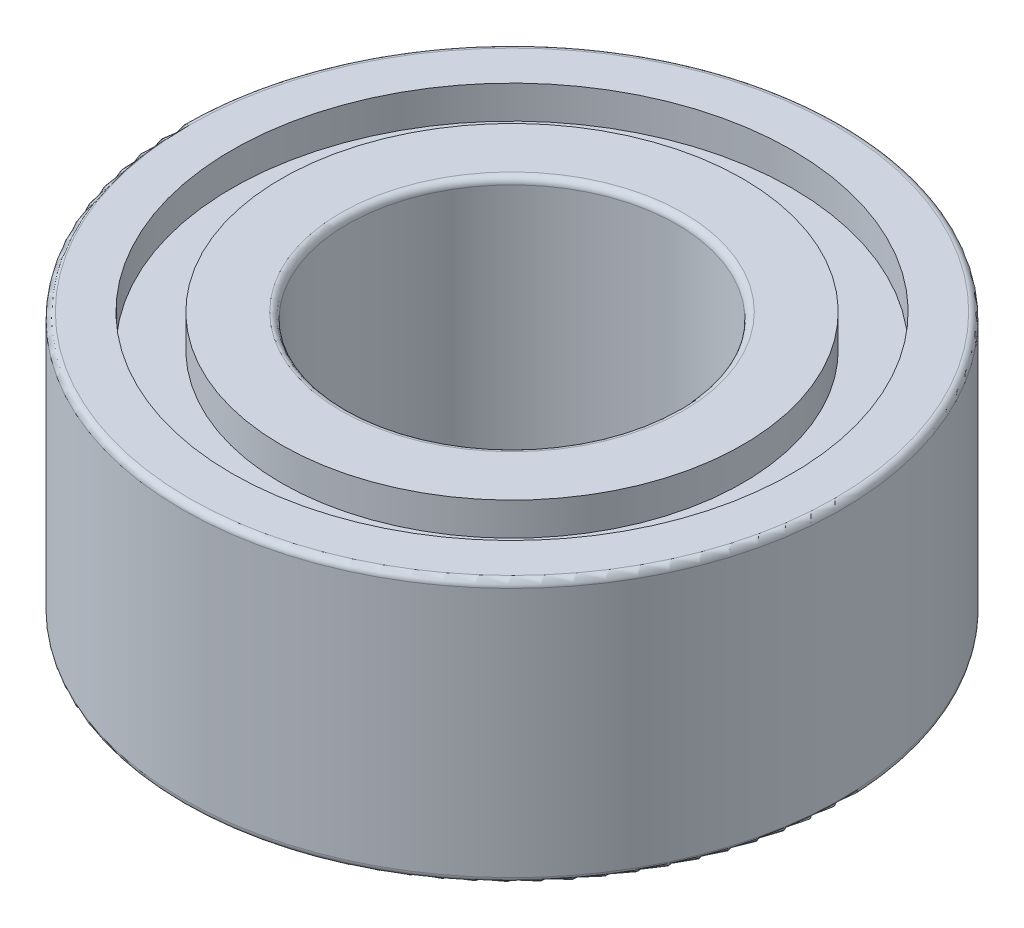
ISO-10303-21;
HEADER;
FILE_DESCRIPTION(('STEP AP214'),'2;1');
FILE_NAME('part.step','',(''),(''),'','','');
FILE_SCHEMA(('AUTOMOTIVE_DESIGN { 1 0 10303 214 1 1 1 1 }'));
ENDSEC;
DATA;
#1=APPLICATION_CONTEXT('core data for automotive mechanical design processes');
#2=APPLICATION_PROTOCOL_DEFINITION('international standard','automotive_design',2000,#1);
#3=PRODUCT_CONTEXT('',#1,'mechanical');
#4=PRODUCT('Part','Part','',(#3));
#5=PRODUCT_RELATED_PRODUCT_CATEGORY('part','',(#4));
#6=PRODUCT_DEFINITION_FORMATION('','',#4);
#7=PRODUCT_DEFINITION_CONTEXT('part definition',#1,'design');
#8=PRODUCT_DEFINITION('design','',#6,#7);
#9=PRODUCT_DEFINITION_SHAPE('','',#8);
#10=(LENGTH_UNIT() NAMED_UNIT(*) SI_UNIT(.MILLI.,.METRE.));
#11=(NAMED_UNIT(*) PLANE_ANGLE_UNIT() SI_UNIT($,.RADIAN.));
#12=(NAMED_UNIT(*) SI_UNIT($,.STERADIAN.) SOLID_ANGLE_UNIT());
#13=UNCERTAINTY_MEASURE_WITH_UNIT(LENGTH_MEASURE(1.E-05),#10,'distance_accuracy_value','');
#14=(GEOMETRIC_REPRESENTATION_CONTEXT(3) GLOBAL_UNCERTAINTY_ASSIGNED_CONTEXT((#13)) GLOBAL_UNIT_ASSIGNED_CONTEXT((#10,
#11,#12)) REPRESENTATION_CONTEXT('',''));
#15=CARTESIAN_POINT('',(0.,0.,0.));
#16=DIRECTION('',(0.,0.,1.));
#17=DIRECTION('',(1.,0.,0.));
#18=AXIS2_PLACEMENT_3D('',#15,#16,#17);
#19=CARTESIAN_POINT('',(0.,-2.,0.));
#20=DIRECTION('',(0.,1.,0.));
#21=DIRECTION('',(0.,0.,1.));
#22=AXIS2_PLACEMENT_3D('',#19,#20,#21);
#23=PLANE('',#22);
#24=CARTESIAN_POINT('',(0.,-2.,0.));
#25=DIRECTION('',(0.,1.,0.));
#26=DIRECTION('',(0.,0.,1.));
#27=AXIS2_PLACEMENT_3D('',#24,#25,#26);
#28=CIRCLE('',#27,2.6);
#29=CARTESIAN_POINT('',(0.,-2.,2.6));
#30=VERTEX_POINT('',#29);
#31=EDGE_CURVE('E59',#30,#30,#28,.T.);
#32=ORIENTED_EDGE('',*,*,#31,.T.);
#33=EDGE_LOOP('',(#32));
#34=FACE_BOUND('',#33,.T.);
#35=CARTESIAN_POINT('',(0.,-2.,0.));
#36=DIRECTION('',(0.,1.,0.));
#37=DIRECTION('',(0.,0.,1.));
#38=AXIS2_PLACEMENT_3D('',#35,#36,#37);
#39=CIRCLE('',#38,3.5);
#40=CARTESIAN_POINT('',(0.,-2.,3.5));
#41=VERTEX_POINT('',#40);
#42=EDGE_CURVE('E84',#41,#41,#39,.T.);
#43=ORIENTED_EDGE('',*,*,#42,.F.);
#44=EDGE_LOOP('',(#43));
#45=FACE_BOUND('',#44,.T.);
#46=ADVANCED_FACE('F33',(#34,#45),#23,.F.);
#47=CARTESIAN_POINT('',(0.,2.,0.));
#48=DIRECTION('',(0.,1.,0.));
#49=DIRECTION('',(0.,0.,1.));
#50=AXIS2_PLACEMENT_3D('',#47,#48,#49);
#51=PLANE('',#50);
#52=CARTESIAN_POINT('',(0.,2.,0.));
#53=DIRECTION('',(0.,1.,0.));
#54=DIRECTION('',(0.,0.,1.));
#55=AXIS2_PLACEMENT_3D('',#52,#53,#54);
#56=CIRCLE('',#55,2.6);
#57=CARTESIAN_POINT('',(0.,2.,2.6));
#58=VERTEX_POINT('',#57);
#59=EDGE_CURVE('E40',#58,#58,#56,.F.);
#60=ORIENTED_EDGE('',*,*,#59,.T.);
#61=EDGE_LOOP('',(#60));
#62=FACE_BOUND('',#61,.T.);
#63=CARTESIAN_POINT('',(0.,2.,0.));
#64=DIRECTION('',(0.,1.,0.));
#65=DIRECTION('',(0.,0.,1.));
#66=AXIS2_PLACEMENT_3D('',#63,#64,#65);
#67=CIRCLE('',#66,3.5);
#68=CARTESIAN_POINT('',(0.,2.,3.5));
#69=VERTEX_POINT('',#68);
#70=EDGE_CURVE('E72',#69,#69,#67,.T.);
#71=ORIENTED_EDGE('',*,*,#70,.T.);
#72=EDGE_LOOP('',(#71));
#73=FACE_BOUND('',#72,.T.);
#74=ADVANCED_FACE('F100',(#62,#73),#51,.T.);
#75=CARTESIAN_POINT('',(0.,-2.,0.));
#76=DIRECTION('',(0.,1.,0.));
#77=DIRECTION('',(0.,0.,1.));
#78=AXIS2_PLACEMENT_3D('',#75,#76,#77);
#79=CYLINDRICAL_SURFACE('',#78,5.);
#80=CARTESIAN_POINT('',(0.,-1.9,0.));
#81=DIRECTION('',(0.,1.,0.));
#82=DIRECTION('',(0.,0.,1.));
#83=AXIS2_PLACEMENT_3D('',#80,#81,#82);
#84=CIRCLE('',#83,5.);
#85=CARTESIAN_POINT('',(0.,-1.9,5.));
#86=VERTEX_POINT('',#85);
#87=EDGE_CURVE('E44',#86,#86,#84,.T.);
#88=ORIENTED_EDGE('',*,*,#87,.T.);
#89=EDGE_LOOP('',(#88));
#90=FACE_BOUND('',#89,.T.);
#91=CARTESIAN_POINT('',(0.,1.9,0.));
#92=DIRECTION('',(0.,1.,0.));
#93=DIRECTION('',(0.,0.,1.));
#94=AXIS2_PLACEMENT_3D('',#91,#92,#93);
#95=CIRCLE('',#94,5.);
#96=CARTESIAN_POINT('',(0.,1.9,5.));
#97=VERTEX_POINT('',#96);
#98=EDGE_CURVE('E48',#97,#97,#95,.F.);
#99=ORIENTED_EDGE('',*,*,#98,.T.);
#100=EDGE_LOOP('',(#99));
#101=FACE_BOUND('',#100,.T.);
#102=ADVANCED_FACE('F107',(#90,#101),#79,.T.);
#103=CARTESIAN_POINT('',(0.,-2.,0.));
#104=DIRECTION('',(0.,1.,0.));
#105=DIRECTION('',(0.,0.,1.));
#106=AXIS2_PLACEMENT_3D('',#103,#104,#105);
#107=CIRCLE('',#106,4.25);
#108=CARTESIAN_POINT('',(0.,-2.,4.25));
#109=VERTEX_POINT('',#108);
#110=EDGE_CURVE('E78',#109,#109,#107,.T.);
#111=ORIENTED_EDGE('',*,*,#110,.T.);
#112=EDGE_LOOP('',(#111));
#113=FACE_BOUND('',#112,.T.);
#114=CARTESIAN_POINT('',(0.,-2.,0.));
#115=DIRECTION('',(0.,1.,0.));
#116=DIRECTION('',(0.,0.,1.));
#117=AXIS2_PLACEMENT_3D('',#114,#115,#116);
#118=CIRCLE('',#117,4.9);
#119=CARTESIAN_POINT('',(0.,-2.,4.9));
#120=VERTEX_POINT('',#119);
#121=EDGE_CURVE('E62',#120,#120,#118,.F.);
#122=ORIENTED_EDGE('',*,*,#121,.T.);
#123=EDGE_LOOP('',(#122));
#124=FACE_BOUND('',#123,.T.);
#125=ADVANCED_FACE('F103',(#113,#124),#23,.F.);
#126=CARTESIAN_POINT('',(0.,-2.,0.));
#127=DIRECTION('',(0.,1.,0.));
#128=DIRECTION('',(0.,0.,1.));
#129=AXIS2_PLACEMENT_3D('',#126,#127,#128);
#130=CYLINDRICAL_SURFACE('',#129,2.5);
#131=CARTESIAN_POINT('',(0.,-1.9,0.));
#132=DIRECTION('',(0.,1.,0.));
#133=DIRECTION('',(0.,0.,1.));
#134=AXIS2_PLACEMENT_3D('',#131,#132,#133);
#135=CIRCLE('',#134,2.5);
#136=CARTESIAN_POINT('',(0.,-1.9,2.5));
#137=VERTEX_POINT('',#136);
#138=EDGE_CURVE('E53',#137,#137,#135,.F.);
#139=ORIENTED_EDGE('',*,*,#138,.T.);
#140=EDGE_LOOP('',(#139));
#141=FACE_BOUND('',#140,.T.);
#142=CARTESIAN_POINT('',(0.,1.9,0.));
#143=DIRECTION('',(0.,1.,0.));
#144=DIRECTION('',(0.,0.,1.));
#145=AXIS2_PLACEMENT_3D('',#142,#143,#144);
#146=CIRCLE('',#145,2.5);
#147=CARTESIAN_POINT('',(0.,1.9,2.5));
#148=VERTEX_POINT('',#147);
#149=EDGE_CURVE('E56',#148,#148,#146,.T.);
#150=ORIENTED_EDGE('',*,*,#149,.T.);
#151=EDGE_LOOP('',(#150));
#152=FACE_BOUND('',#151,.T.);
#153=ADVANCED_FACE('F113',(#141,#152),#130,.F.);
#154=CARTESIAN_POINT('',(0.,2.,0.));
#155=DIRECTION('',(0.,1.,0.));
#156=DIRECTION('',(0.,0.,1.));
#157=AXIS2_PLACEMENT_3D('',#154,#155,#156);
#158=CIRCLE('',#157,4.25);
#159=CARTESIAN_POINT('',(0.,2.,4.25));
#160=VERTEX_POINT('',#159);
#161=EDGE_CURVE('E66',#160,#160,#158,.T.);
#162=ORIENTED_EDGE('',*,*,#161,.F.);
#163=EDGE_LOOP('',(#162));
#164=FACE_BOUND('',#163,.T.);
#165=CARTESIAN_POINT('',(0.,2.,0.));
#166=DIRECTION('',(0.,1.,0.));
#167=DIRECTION('',(0.,0.,1.));
#168=AXIS2_PLACEMENT_3D('',#165,#166,#167);
#169=CIRCLE('',#168,4.9);
#170=CARTESIAN_POINT('',(0.,2.,4.9));
#171=VERTEX_POINT('',#170);
#172=EDGE_CURVE('E10',#171,#171,#169,.T.);
#173=ORIENTED_EDGE('',*,*,#172,.T.);
#174=EDGE_LOOP('',(#173));
#175=FACE_BOUND('',#174,.T.);
#176=ADVANCED_FACE('F109',(#164,#175),#51,.T.);
#177=CARTESIAN_POINT('',(0.,-1.9,0.));
#178=DIRECTION('',(0.,1.,0.));
#179=DIRECTION('',(0.,0.,1.));
#180=AXIS2_PLACEMENT_3D('',#177,#178,#179);
#181=TOROIDAL_SURFACE('',#180,2.6,0.1);
#182=ORIENTED_EDGE('',*,*,#138,.F.);
#183=EDGE_LOOP('',(#182));
#184=FACE_BOUND('',#183,.T.);
#185=ORIENTED_EDGE('',*,*,#31,.F.);
#186=EDGE_LOOP('',(#185));
#187=FACE_BOUND('',#186,.T.);
#188=ADVANCED_FACE('F129',(#184,#187),#181,.T.);
#189=CARTESIAN_POINT('',(0.,-1.9,0.));
#190=DIRECTION('',(0.,1.,0.));
#191=DIRECTION('',(0.,0.,1.));
#192=AXIS2_PLACEMENT_3D('',#189,#190,#191);
#193=TOROIDAL_SURFACE('',#192,4.9,0.1);
#194=ORIENTED_EDGE('',*,*,#121,.F.);
#195=EDGE_LOOP('',(#194));
#196=FACE_BOUND('',#195,.T.);
#197=ORIENTED_EDGE('',*,*,#87,.F.);
#198=EDGE_LOOP('',(#197));
#199=FACE_BOUND('',#198,.T.);
#200=ADVANCED_FACE('F125',(#196,#199),#193,.T.);
#201=CARTESIAN_POINT('',(0.,1.9,0.));
#202=DIRECTION('',(0.,1.,0.));
#203=DIRECTION('',(0.,0.,1.));
#204=AXIS2_PLACEMENT_3D('',#201,#202,#203);
#205=TOROIDAL_SURFACE('',#204,4.9,0.1);
#206=ORIENTED_EDGE('',*,*,#98,.F.);
#207=EDGE_LOOP('',(#206));
#208=FACE_BOUND('',#207,.T.);
#209=ORIENTED_EDGE('',*,*,#172,.F.);
#210=EDGE_LOOP('',(#209));
#211=FACE_BOUND('',#210,.T.);
#212=ADVANCED_FACE('F128',(#208,#211),#205,.T.);
#213=CARTESIAN_POINT('',(0.,1.9,0.));
#214=DIRECTION('',(0.,1.,0.));
#215=DIRECTION('',(0.,0.,1.));
#216=AXIS2_PLACEMENT_3D('',#213,#214,#215);
#217=TOROIDAL_SURFACE('',#216,2.6,0.1);
#218=ORIENTED_EDGE('',*,*,#59,.F.);
#219=EDGE_LOOP('',(#218));
#220=FACE_BOUND('',#219,.T.);
#221=ORIENTED_EDGE('',*,*,#149,.F.);
#222=EDGE_LOOP('',(#221));
#223=FACE_BOUND('',#222,.T.);
#224=ADVANCED_FACE('F35',(#220,#223),#217,.T.);
#225=CARTESIAN_POINT('',(0.,1.5,0.));
#226=DIRECTION('',(0.,1.,0.));
#227=DIRECTION('',(0.,0.,1.));
#228=AXIS2_PLACEMENT_3D('',#225,#226,#227);
#229=CYLINDRICAL_SURFACE('',#228,4.25);
#230=CARTESIAN_POINT('',(0.,1.5,0.));
#231=DIRECTION('',(0.,1.,0.));
#232=DIRECTION('',(0.,0.,1.));
#233=AXIS2_PLACEMENT_3D('',#230,#231,#232);
#234=CIRCLE('',#233,4.25);
#235=CARTESIAN_POINT('',(0.,1.5,4.25));
#236=VERTEX_POINT('',#235);
#237=EDGE_CURVE('E65',#236,#236,#234,.T.);
#238=ORIENTED_EDGE('',*,*,#237,.F.);
#239=EDGE_LOOP('',(#238));
#240=FACE_BOUND('',#239,.T.);
#241=ORIENTED_EDGE('',*,*,#161,.T.);
#242=EDGE_LOOP('',(#241));
#243=FACE_BOUND('',#242,.T.);
#244=ADVANCED_FACE('F140',(#240,#243),#229,.F.);
#245=CARTESIAN_POINT('',(0.,1.5,0.));
#246=DIRECTION('',(0.,1.,0.));
#247=DIRECTION('',(0.,0.,1.));
#248=AXIS2_PLACEMENT_3D('',#245,#246,#247);
#249=PLANE('',#248);
#250=CARTESIAN_POINT('',(0.,1.5,0.));
#251=DIRECTION('',(0.,1.,0.));
#252=DIRECTION('',(0.,0.,1.));
#253=AXIS2_PLACEMENT_3D('',#250,#251,#252);
#254=CIRCLE('',#253,3.5);
#255=CARTESIAN_POINT('',(0.,1.5,3.5));
#256=VERTEX_POINT('',#255);
#257=EDGE_CURVE('E69',#256,#256,#254,.T.);
#258=ORIENTED_EDGE('',*,*,#257,.F.);
#259=EDGE_LOOP('',(#258));
#260=FACE_BOUND('',#259,.T.);
#261=ORIENTED_EDGE('',*,*,#237,.T.);
#262=EDGE_LOOP('',(#261));
#263=FACE_BOUND('',#262,.T.);
#264=ADVANCED_FACE('F161',(#260,#263),#249,.T.);
#265=CARTESIAN_POINT('',(0.,1.5,0.));
#266=DIRECTION('',(0.,1.,0.));
#267=DIRECTION('',(0.,0.,1.));
#268=AXIS2_PLACEMENT_3D('',#265,#266,#267);
#269=CYLINDRICAL_SURFACE('',#268,3.5);
#270=ORIENTED_EDGE('',*,*,#257,.T.);
#271=EDGE_LOOP('',(#270));
#272=FACE_BOUND('',#271,.T.);
#273=ORIENTED_EDGE('',*,*,#70,.F.);
#274=EDGE_LOOP('',(#273));
#275=FACE_BOUND('',#274,.T.);
#276=ADVANCED_FACE('F165',(#272,#275),#269,.T.);
#277=CARTESIAN_POINT('',(0.,-1.5,0.));
#278=DIRECTION('',(0.,-1.,0.));
#279=DIRECTION('',(0.,0.,1.));
#280=AXIS2_PLACEMENT_3D('',#277,#278,#279);
#281=PLANE('',#280);
#282=CARTESIAN_POINT('',(0.,-1.5,0.));
#283=DIRECTION('',(0.,1.,0.));
#284=DIRECTION('',(0.,0.,1.));
#285=AXIS2_PLACEMENT_3D('',#282,#283,#284);
#286=CIRCLE('',#285,4.25);
#287=CARTESIAN_POINT('',(0.,-1.5,4.25));
#288=VERTEX_POINT('',#287);
#289=EDGE_CURVE('E75',#288,#288,#286,.T.);
#290=ORIENTED_EDGE('',*,*,#289,.F.);
#291=EDGE_LOOP('',(#290));
#292=FACE_BOUND('',#291,.T.);
#293=CARTESIAN_POINT('',(0.,-1.5,0.));
#294=DIRECTION('',(0.,1.,0.));
#295=DIRECTION('',(0.,0.,1.));
#296=AXIS2_PLACEMENT_3D('',#293,#294,#295);
#297=CIRCLE('',#296,3.5);
#298=CARTESIAN_POINT('',(0.,-1.5,3.5));
#299=VERTEX_POINT('',#298);
#300=EDGE_CURVE('E81',#299,#299,#297,.T.);
#301=ORIENTED_EDGE('',*,*,#300,.T.);
#302=EDGE_LOOP('',(#301));
#303=FACE_BOUND('',#302,.T.);
#304=ADVANCED_FACE('F90',(#292,#303),#281,.T.);
#305=CARTESIAN_POINT('',(0.,-1.5,0.));
#306=DIRECTION('',(0.,-1.,0.));
#307=DIRECTION('',(0.,0.,-1.));
#308=AXIS2_PLACEMENT_3D('',#305,#306,#307);
#309=CYLINDRICAL_SURFACE('',#308,4.25);
#310=ORIENTED_EDGE('',*,*,#289,.T.);
#311=EDGE_LOOP('',(#310));
#312=FACE_BOUND('',#311,.T.);
#313=ORIENTED_EDGE('',*,*,#110,.F.);
#314=EDGE_LOOP('',(#313));
#315=FACE_BOUND('',#314,.T.);
#316=ADVANCED_FACE('F95',(#312,#315),#309,.F.);
#317=CARTESIAN_POINT('',(0.,-1.5,0.));
#318=DIRECTION('',(0.,-1.,0.));
#319=DIRECTION('',(0.,0.,-1.));
#320=AXIS2_PLACEMENT_3D('',#317,#318,#319);
#321=CYLINDRICAL_SURFACE('',#320,3.5);
#322=ORIENTED_EDGE('',*,*,#300,.F.);
#323=EDGE_LOOP('',(#322));
#324=FACE_BOUND('',#323,.T.);
#325=ORIENTED_EDGE('',*,*,#42,.T.);
#326=EDGE_LOOP('',(#325));
#327=FACE_BOUND('',#326,.T.);
#328=ADVANCED_FACE('F92',(#324,#327),#321,.T.);
#329=CLOSED_SHELL('',(#46,#74,#102,#125,#153,#176,#188,#200,#212,#224,#244,#264,#276,#304,#316,#328));
#330=MANIFOLD_SOLID_BREP('B2',#329);
#331=ADVANCED_BREP_SHAPE_REPRESENTATION('',(#18,#330),#14);
#332=SHAPE_DEFINITION_REPRESENTATION(#9,#331);
ENDSEC;
END-ISO-10303-21;
